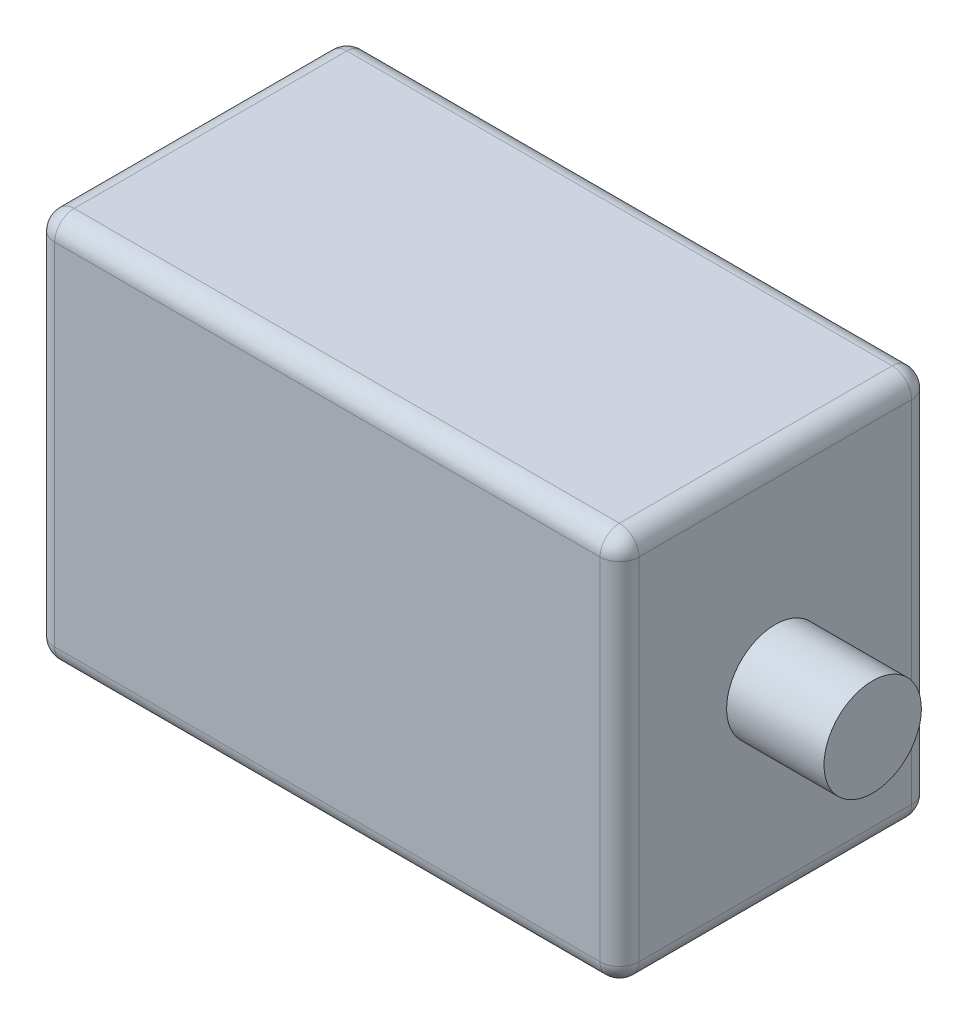
ISO-10303-21;
HEADER;
FILE_DESCRIPTION(('STEP AP214'),'2;1');
FILE_NAME('part.step','',(''),(''),'','','');
FILE_SCHEMA(('AUTOMOTIVE_DESIGN { 1 0 10303 214 1 1 1 1 }'));
ENDSEC;
DATA;
#1=APPLICATION_CONTEXT('core data for automotive mechanical design processes');
#2=APPLICATION_PROTOCOL_DEFINITION('international standard','automotive_design',2000,#1);
#3=PRODUCT_CONTEXT('',#1,'mechanical');
#4=PRODUCT('Part','Part','',(#3));
#5=PRODUCT_RELATED_PRODUCT_CATEGORY('part','',(#4));
#6=PRODUCT_DEFINITION_FORMATION('','',#4);
#7=PRODUCT_DEFINITION_CONTEXT('part definition',#1,'design');
#8=PRODUCT_DEFINITION('design','',#6,#7);
#9=PRODUCT_DEFINITION_SHAPE('','',#8);
#10=(LENGTH_UNIT() NAMED_UNIT(*) SI_UNIT(.MILLI.,.METRE.));
#11=(NAMED_UNIT(*) PLANE_ANGLE_UNIT() SI_UNIT($,.RADIAN.));
#12=(NAMED_UNIT(*) SI_UNIT($,.STERADIAN.) SOLID_ANGLE_UNIT());
#13=UNCERTAINTY_MEASURE_WITH_UNIT(LENGTH_MEASURE(1.E-05),#10,'distance_accuracy_value','');
#14=(GEOMETRIC_REPRESENTATION_CONTEXT(3) GLOBAL_UNCERTAINTY_ASSIGNED_CONTEXT((#13)) GLOBAL_UNIT_ASSIGNED_CONTEXT((#10,
#11,#12)) REPRESENTATION_CONTEXT('',''));
#15=CARTESIAN_POINT('',(0.,0.,0.));
#16=DIRECTION('',(0.,0.,1.));
#17=DIRECTION('',(1.,0.,0.));
#18=AXIS2_PLACEMENT_3D('',#15,#16,#17);
#19=CARTESIAN_POINT('',(15.,10.,16.));
#20=DIRECTION('',(-1.,0.,0.));
#21=DIRECTION('',(0.,-1.,0.));
#22=AXIS2_PLACEMENT_3D('',#19,#20,#21);
#23=PLANE('',#22);
#24=DIRECTION('',(0.,1.,0.));
#25=VECTOR('',#24,1.);
#26=CARTESIAN_POINT('',(15.,-10.,15.));
#27=LINE('',#26,#25);
#28=CARTESIAN_POINT('',(15.,9.,15.));
#29=VERTEX_POINT('',#28);
#30=CARTESIAN_POINT('',(15.,-9.,15.));
#31=VERTEX_POINT('',#30);
#32=EDGE_CURVE('E139',#29,#31,#27,.F.);
#33=ORIENTED_EDGE('',*,*,#32,.T.);
#34=DIRECTION('',(0.,0.,-1.));
#35=VECTOR('',#34,1.);
#36=CARTESIAN_POINT('',(15.,-9.,16.));
#37=LINE('',#36,#35);
#38=CARTESIAN_POINT('',(15.,-9.,1.));
#39=VERTEX_POINT('',#38);
#40=EDGE_CURVE('E134',#31,#39,#37,.T.);
#41=ORIENTED_EDGE('',*,*,#40,.T.);
#42=DIRECTION('',(0.,1.,0.));
#43=VECTOR('',#42,1.);
#44=CARTESIAN_POINT('',(15.,10.,1.));
#45=LINE('',#44,#43);
#46=CARTESIAN_POINT('',(15.,9.,1.));
#47=VERTEX_POINT('',#46);
#48=EDGE_CURVE('E128',#39,#47,#45,.T.);
#49=ORIENTED_EDGE('',*,*,#48,.T.);
#50=DIRECTION('',(0.,0.,-1.));
#51=VECTOR('',#50,1.);
#52=CARTESIAN_POINT('',(15.,9.,16.));
#53=LINE('',#52,#51);
#54=EDGE_CURVE('E131',#47,#29,#53,.F.);
#55=ORIENTED_EDGE('',*,*,#54,.T.);
#56=EDGE_LOOP('',(#33,#41,#49,#55));
#57=FACE_BOUND('',#56,.T.);
#58=CARTESIAN_POINT('',(15.,0.,8.));
#59=DIRECTION('',(1.,0.,0.));
#60=DIRECTION('',(0.,1.,0.));
#61=AXIS2_PLACEMENT_3D('',#58,#59,#60);
#62=CIRCLE('',#61,2.5);
#63=CARTESIAN_POINT('',(15.,2.5,8.));
#64=VERTEX_POINT('',#63);
#65=EDGE_CURVE('E152',#64,#64,#62,.T.);
#66=ORIENTED_EDGE('',*,*,#65,.F.);
#67=EDGE_LOOP('',(#66));
#68=FACE_BOUND('',#67,.T.);
#69=ADVANCED_FACE('F39',(#57,#68),#23,.F.);
#70=CARTESIAN_POINT('',(-15.,10.,16.));
#71=DIRECTION('',(0.,-1.,0.));
#72=DIRECTION('',(0.,0.,-1.));
#73=AXIS2_PLACEMENT_3D('',#70,#71,#72);
#74=PLANE('',#73);
#75=DIRECTION('',(-1.,0.,0.));
#76=VECTOR('',#75,1.);
#77=CARTESIAN_POINT('',(-15.,10.,1.));
#78=LINE('',#77,#76);
#79=CARTESIAN_POINT('',(14.,10.,1.));
#80=VERTEX_POINT('',#79);
#81=CARTESIAN_POINT('',(-14.,10.,1.));
#82=VERTEX_POINT('',#81);
#83=EDGE_CURVE('E285',#80,#82,#78,.T.);
#84=ORIENTED_EDGE('',*,*,#83,.T.);
#85=DIRECTION('',(0.,0.,-1.));
#86=VECTOR('',#85,1.);
#87=CARTESIAN_POINT('',(-14.,10.,16.));
#88=LINE('',#87,#86);
#89=CARTESIAN_POINT('',(-14.,10.,15.));
#90=VERTEX_POINT('',#89);
#91=EDGE_CURVE('E294',#82,#90,#88,.F.);
#92=ORIENTED_EDGE('',*,*,#91,.T.);
#93=DIRECTION('',(-1.,0.,0.));
#94=VECTOR('',#93,1.);
#95=CARTESIAN_POINT('',(15.,10.,15.));
#96=LINE('',#95,#94);
#97=CARTESIAN_POINT('',(14.,10.,15.));
#98=VERTEX_POINT('',#97);
#99=EDGE_CURVE('E291',#90,#98,#96,.F.);
#100=ORIENTED_EDGE('',*,*,#99,.T.);
#101=DIRECTION('',(0.,0.,-1.));
#102=VECTOR('',#101,1.);
#103=CARTESIAN_POINT('',(14.,10.,16.));
#104=LINE('',#103,#102);
#105=EDGE_CURVE('E288',#98,#80,#104,.T.);
#106=ORIENTED_EDGE('',*,*,#105,.T.);
#107=EDGE_LOOP('',(#84,#92,#100,#106));
#108=FACE_BOUND('',#107,.T.);
#109=ADVANCED_FACE('F360',(#108),#74,.F.);
#110=CARTESIAN_POINT('',(-15.,10.,16.));
#111=DIRECTION('',(1.,0.,0.));
#112=DIRECTION('',(0.,0.,-1.));
#113=AXIS2_PLACEMENT_3D('',#110,#111,#112);
#114=PLANE('',#113);
#115=DIRECTION('',(0.,0.,-1.));
#116=VECTOR('',#115,1.);
#117=CARTESIAN_POINT('',(-15.,-9.,16.));
#118=LINE('',#117,#116);
#119=CARTESIAN_POINT('',(-15.,-9.,1.));
#120=VERTEX_POINT('',#119);
#121=CARTESIAN_POINT('',(-15.,-9.,15.));
#122=VERTEX_POINT('',#121);
#123=EDGE_CURVE('E272',#120,#122,#118,.F.);
#124=ORIENTED_EDGE('',*,*,#123,.T.);
#125=DIRECTION('',(0.,-1.,0.));
#126=VECTOR('',#125,1.);
#127=CARTESIAN_POINT('',(-15.,10.,15.));
#128=LINE('',#127,#126);
#129=CARTESIAN_POINT('',(-15.,9.,15.));
#130=VERTEX_POINT('',#129);
#131=EDGE_CURVE('E281',#122,#130,#128,.F.);
#132=ORIENTED_EDGE('',*,*,#131,.T.);
#133=DIRECTION('',(0.,0.,-1.));
#134=VECTOR('',#133,1.);
#135=CARTESIAN_POINT('',(-15.,9.,16.));
#136=LINE('',#135,#134);
#137=CARTESIAN_POINT('',(-15.,9.,1.));
#138=VERTEX_POINT('',#137);
#139=EDGE_CURVE('E278',#130,#138,#136,.T.);
#140=ORIENTED_EDGE('',*,*,#139,.T.);
#141=DIRECTION('',(0.,-1.,0.));
#142=VECTOR('',#141,1.);
#143=CARTESIAN_POINT('',(-15.,10.,1.));
#144=LINE('',#143,#142);
#145=EDGE_CURVE('E275',#138,#120,#144,.T.);
#146=ORIENTED_EDGE('',*,*,#145,.T.);
#147=EDGE_LOOP('',(#124,#132,#140,#146));
#148=FACE_BOUND('',#147,.T.);
#149=ADVANCED_FACE('F364',(#148),#114,.F.);
#150=CARTESIAN_POINT('',(-15.,-10.,16.));
#151=DIRECTION('',(0.,1.,0.));
#152=DIRECTION('',(0.,0.,1.));
#153=AXIS2_PLACEMENT_3D('',#150,#151,#152);
#154=PLANE('',#153);
#155=DIRECTION('',(0.,0.,-1.));
#156=VECTOR('',#155,1.);
#157=CARTESIAN_POINT('',(-14.,-10.,16.));
#158=LINE('',#157,#156);
#159=CARTESIAN_POINT('',(-14.,-10.,15.));
#160=VERTEX_POINT('',#159);
#161=CARTESIAN_POINT('',(-14.,-10.,1.));
#162=VERTEX_POINT('',#161);
#163=EDGE_CURVE('E249',#160,#162,#158,.T.);
#164=ORIENTED_EDGE('',*,*,#163,.T.);
#165=DIRECTION('',(1.,0.,0.));
#166=VECTOR('',#165,1.);
#167=CARTESIAN_POINT('',(-15.,-10.,1.));
#168=LINE('',#167,#166);
#169=CARTESIAN_POINT('',(14.,-10.,1.));
#170=VERTEX_POINT('',#169);
#171=EDGE_CURVE('E256',#162,#170,#168,.T.);
#172=ORIENTED_EDGE('',*,*,#171,.T.);
#173=DIRECTION('',(0.,0.,-1.));
#174=VECTOR('',#173,1.);
#175=CARTESIAN_POINT('',(14.,-10.,16.));
#176=LINE('',#175,#174);
#177=CARTESIAN_POINT('',(14.,-10.,15.));
#178=VERTEX_POINT('',#177);
#179=EDGE_CURVE('E252',#170,#178,#176,.F.);
#180=ORIENTED_EDGE('',*,*,#179,.T.);
#181=DIRECTION('',(1.,0.,0.));
#182=VECTOR('',#181,1.);
#183=CARTESIAN_POINT('',(-15.,-10.,15.));
#184=LINE('',#183,#182);
#185=EDGE_CURVE('E246',#178,#160,#184,.F.);
#186=ORIENTED_EDGE('',*,*,#185,.T.);
#187=EDGE_LOOP('',(#164,#172,#180,#186));
#188=FACE_BOUND('',#187,.T.);
#189=ADVANCED_FACE('F336',(#188),#154,.F.);
#190=CARTESIAN_POINT('',(0.,0.,16.));
#191=DIRECTION('',(0.,0.,1.));
#192=DIRECTION('',(1.,0.,0.));
#193=AXIS2_PLACEMENT_3D('',#190,#191,#192);
#194=PLANE('',#193);
#195=DIRECTION('',(-1.,0.,0.));
#196=VECTOR('',#195,1.);
#197=CARTESIAN_POINT('',(-15.,9.,16.));
#198=LINE('',#197,#196);
#199=CARTESIAN_POINT('',(14.,9.,16.));
#200=VERTEX_POINT('',#199);
#201=CARTESIAN_POINT('',(-14.,9.,16.));
#202=VERTEX_POINT('',#201);
#203=EDGE_CURVE('E262',#200,#202,#198,.T.);
#204=ORIENTED_EDGE('',*,*,#203,.T.);
#205=DIRECTION('',(0.,-1.,0.));
#206=VECTOR('',#205,1.);
#207=CARTESIAN_POINT('',(-14.,-10.,16.));
#208=LINE('',#207,#206);
#209=CARTESIAN_POINT('',(-14.,-9.,16.));
#210=VERTEX_POINT('',#209);
#211=EDGE_CURVE('E268',#202,#210,#208,.T.);
#212=ORIENTED_EDGE('',*,*,#211,.T.);
#213=DIRECTION('',(1.,0.,0.));
#214=VECTOR('',#213,1.);
#215=CARTESIAN_POINT('',(15.,-9.,16.));
#216=LINE('',#215,#214);
#217=CARTESIAN_POINT('',(14.,-9.,16.));
#218=VERTEX_POINT('',#217);
#219=EDGE_CURVE('E265',#210,#218,#216,.T.);
#220=ORIENTED_EDGE('',*,*,#219,.T.);
#221=DIRECTION('',(0.,1.,0.));
#222=VECTOR('',#221,1.);
#223=CARTESIAN_POINT('',(14.,10.,16.));
#224=LINE('',#223,#222);
#225=EDGE_CURVE('E259',#218,#200,#224,.T.);
#226=ORIENTED_EDGE('',*,*,#225,.T.);
#227=EDGE_LOOP('',(#204,#212,#220,#226));
#228=FACE_BOUND('',#227,.T.);
#229=ADVANCED_FACE('F562',(#228),#194,.T.);
#230=CARTESIAN_POINT('',(0.,0.,0.));
#231=DIRECTION('',(0.,0.,1.));
#232=DIRECTION('',(1.,0.,0.));
#233=AXIS2_PLACEMENT_3D('',#230,#231,#232);
#234=PLANE('',#233);
#235=DIRECTION('',(1.,0.,0.));
#236=VECTOR('',#235,1.);
#237=CARTESIAN_POINT('',(0.,-9.,0.));
#238=LINE('',#237,#236);
#239=CARTESIAN_POINT('',(14.,-9.,0.));
#240=VERTEX_POINT('',#239);
#241=CARTESIAN_POINT('',(-14.,-9.,0.));
#242=VERTEX_POINT('',#241);
#243=EDGE_CURVE('E49',#240,#242,#238,.F.);
#244=ORIENTED_EDGE('',*,*,#243,.T.);
#245=DIRECTION('',(0.,-1.,0.));
#246=VECTOR('',#245,1.);
#247=CARTESIAN_POINT('',(-14.,0.,0.));
#248=LINE('',#247,#246);
#249=CARTESIAN_POINT('',(-14.,9.,0.));
#250=VERTEX_POINT('',#249);
#251=EDGE_CURVE('E11',#242,#250,#248,.F.);
#252=ORIENTED_EDGE('',*,*,#251,.T.);
#253=DIRECTION('',(-1.,0.,0.));
#254=VECTOR('',#253,1.);
#255=CARTESIAN_POINT('',(0.,9.,0.));
#256=LINE('',#255,#254);
#257=CARTESIAN_POINT('',(14.,9.,0.));
#258=VERTEX_POINT('',#257);
#259=EDGE_CURVE('E298',#250,#258,#256,.F.);
#260=ORIENTED_EDGE('',*,*,#259,.T.);
#261=DIRECTION('',(0.,1.,0.));
#262=VECTOR('',#261,1.);
#263=CARTESIAN_POINT('',(14.,0.,0.));
#264=LINE('',#263,#262);
#265=EDGE_CURVE('E60',#258,#240,#264,.F.);
#266=ORIENTED_EDGE('',*,*,#265,.T.);
#267=EDGE_LOOP('',(#244,#252,#260,#266));
#268=FACE_BOUND('',#267,.T.);
#269=ADVANCED_FACE('F354',(#268),#234,.F.);
#270=CARTESIAN_POINT('',(20.,0.,8.));
#271=DIRECTION('',(-1.,0.,0.));
#272=DIRECTION('',(0.,-1.,0.));
#273=AXIS2_PLACEMENT_3D('',#270,#271,#272);
#274=CYLINDRICAL_SURFACE('',#273,2.5);
#275=CARTESIAN_POINT('',(20.,0.,8.));
#276=DIRECTION('',(1.,0.,0.));
#277=DIRECTION('',(0.,1.,0.));
#278=AXIS2_PLACEMENT_3D('',#275,#276,#277);
#279=CIRCLE('',#278,2.5);
#280=CARTESIAN_POINT('',(20.,2.5,8.));
#281=VERTEX_POINT('',#280);
#282=EDGE_CURVE('E227',#281,#281,#279,.T.);
#283=ORIENTED_EDGE('',*,*,#282,.F.);
#284=EDGE_LOOP('',(#283));
#285=FACE_BOUND('',#284,.T.);
#286=ORIENTED_EDGE('',*,*,#65,.T.);
#287=EDGE_LOOP('',(#286));
#288=FACE_BOUND('',#287,.T.);
#289=ADVANCED_FACE('F547',(#285,#288),#274,.T.);
#290=CARTESIAN_POINT('',(20.,0.,8.));
#291=DIRECTION('',(1.,0.,0.));
#292=DIRECTION('',(0.,1.,0.));
#293=AXIS2_PLACEMENT_3D('',#290,#291,#292);
#294=PLANE('',#293);
#295=ORIENTED_EDGE('',*,*,#282,.T.);
#296=EDGE_LOOP('',(#295));
#297=FACE_BOUND('',#296,.T.);
#298=ADVANCED_FACE('F539',(#297),#294,.T.);
#299=CARTESIAN_POINT('',(-14.,9.,16.));
#300=DIRECTION('',(0.,0.,-1.));
#301=DIRECTION('',(-1.,0.,0.));
#302=AXIS2_PLACEMENT_3D('',#299,#300,#301);
#303=CYLINDRICAL_SURFACE('',#302,1.);
#304=CARTESIAN_POINT('',(-14.,9.,15.));
#305=DIRECTION('',(0.,0.,1.));
#306=DIRECTION('',(1.,0.,0.));
#307=AXIS2_PLACEMENT_3D('',#304,#305,#306);
#308=CIRCLE('',#307,1.);
#309=EDGE_CURVE('E43',#90,#130,#308,.T.);
#310=ORIENTED_EDGE('',*,*,#309,.F.);
#311=ORIENTED_EDGE('',*,*,#91,.F.);
#312=CARTESIAN_POINT('',(-14.,9.,1.));
#313=DIRECTION('',(0.,0.,-1.));
#314=DIRECTION('',(-1.,0.,0.));
#315=AXIS2_PLACEMENT_3D('',#312,#313,#314);
#316=CIRCLE('',#315,1.);
#317=EDGE_CURVE('E218',#138,#82,#316,.T.);
#318=ORIENTED_EDGE('',*,*,#317,.F.);
#319=ORIENTED_EDGE('',*,*,#139,.F.);
#320=EDGE_LOOP('',(#310,#311,#318,#319));
#321=FACE_BOUND('',#320,.T.);
#322=ADVANCED_FACE('F41',(#321),#303,.T.);
#323=CARTESIAN_POINT('',(-14.,9.,15.));
#324=DIRECTION('',(0.,0.,1.));
#325=DIRECTION('',(1.,0.,0.));
#326=AXIS2_PLACEMENT_3D('',#323,#324,#325);
#327=SPHERICAL_SURFACE('',#326,1.);
#328=CARTESIAN_POINT('',(-14.,9.,15.));
#329=DIRECTION('',(-1.,0.,0.));
#330=DIRECTION('',(0.,0.,1.));
#331=AXIS2_PLACEMENT_3D('',#328,#329,#330);
#332=CIRCLE('',#331,1.);
#333=EDGE_CURVE('E212',#90,#202,#332,.F.);
#334=ORIENTED_EDGE('',*,*,#333,.F.);
#335=ORIENTED_EDGE('',*,*,#309,.T.);
#336=CARTESIAN_POINT('',(-14.,9.,15.));
#337=DIRECTION('',(0.,1.,0.));
#338=DIRECTION('',(0.,0.,1.));
#339=AXIS2_PLACEMENT_3D('',#336,#337,#338);
#340=CIRCLE('',#339,1.);
#341=EDGE_CURVE('E216',#202,#130,#340,.F.);
#342=ORIENTED_EDGE('',*,*,#341,.F.);
#343=EDGE_LOOP('',(#334,#335,#342));
#344=FACE_BOUND('',#343,.T.);
#345=ADVANCED_FACE('F525',(#344),#327,.T.);
#346=CARTESIAN_POINT('',(-14.,9.,1.));
#347=DIRECTION('',(0.,0.,1.));
#348=DIRECTION('',(1.,0.,0.));
#349=AXIS2_PLACEMENT_3D('',#346,#347,#348);
#350=SPHERICAL_SURFACE('',#349,1.);
#351=CARTESIAN_POINT('',(-14.,9.,1.));
#352=DIRECTION('',(0.,1.,0.));
#353=DIRECTION('',(0.,0.,1.));
#354=AXIS2_PLACEMENT_3D('',#351,#352,#353);
#355=CIRCLE('',#354,1.);
#356=EDGE_CURVE('E204',#138,#250,#355,.F.);
#357=ORIENTED_EDGE('',*,*,#356,.F.);
#358=ORIENTED_EDGE('',*,*,#317,.T.);
#359=CARTESIAN_POINT('',(-14.,9.,1.));
#360=DIRECTION('',(-1.,0.,0.));
#361=DIRECTION('',(0.,0.,1.));
#362=AXIS2_PLACEMENT_3D('',#359,#360,#361);
#363=CIRCLE('',#362,1.);
#364=EDGE_CURVE('E208',#250,#82,#363,.F.);
#365=ORIENTED_EDGE('',*,*,#364,.F.);
#366=EDGE_LOOP('',(#357,#358,#365));
#367=FACE_BOUND('',#366,.T.);
#368=ADVANCED_FACE('F517',(#367),#350,.T.);
#369=CARTESIAN_POINT('',(-14.,0.,15.));
#370=DIRECTION('',(0.,1.,0.));
#371=DIRECTION('',(0.,0.,1.));
#372=AXIS2_PLACEMENT_3D('',#369,#370,#371);
#373=CYLINDRICAL_SURFACE('',#372,1.);
#374=ORIENTED_EDGE('',*,*,#341,.T.);
#375=ORIENTED_EDGE('',*,*,#131,.F.);
#376=CARTESIAN_POINT('',(-14.,-9.,15.));
#377=DIRECTION('',(0.,-1.,0.));
#378=DIRECTION('',(0.,0.,-1.));
#379=AXIS2_PLACEMENT_3D('',#376,#377,#378);
#380=CIRCLE('',#379,1.);
#381=EDGE_CURVE('E196',#210,#122,#380,.T.);
#382=ORIENTED_EDGE('',*,*,#381,.F.);
#383=ORIENTED_EDGE('',*,*,#211,.F.);
#384=EDGE_LOOP('',(#374,#375,#382,#383));
#385=FACE_BOUND('',#384,.T.);
#386=ADVANCED_FACE('F369',(#385),#373,.T.);
#387=CARTESIAN_POINT('',(0.,9.,15.));
#388=DIRECTION('',(1.,0.,0.));
#389=DIRECTION('',(0.,0.,-1.));
#390=AXIS2_PLACEMENT_3D('',#387,#388,#389);
#391=CYLINDRICAL_SURFACE('',#390,1.);
#392=ORIENTED_EDGE('',*,*,#333,.T.);
#393=ORIENTED_EDGE('',*,*,#203,.F.);
#394=CARTESIAN_POINT('',(14.,9.,15.));
#395=DIRECTION('',(1.,0.,0.));
#396=DIRECTION('',(0.,0.,-1.));
#397=AXIS2_PLACEMENT_3D('',#394,#395,#396);
#398=CIRCLE('',#397,1.);
#399=EDGE_CURVE('E192',#98,#200,#398,.T.);
#400=ORIENTED_EDGE('',*,*,#399,.F.);
#401=ORIENTED_EDGE('',*,*,#99,.F.);
#402=EDGE_LOOP('',(#392,#393,#400,#401));
#403=FACE_BOUND('',#402,.T.);
#404=ADVANCED_FACE('F501',(#403),#391,.T.);
#405=CARTESIAN_POINT('',(14.,9.,16.));
#406=DIRECTION('',(0.,0.,-1.));
#407=DIRECTION('',(-1.,0.,0.));
#408=AXIS2_PLACEMENT_3D('',#405,#406,#407);
#409=CYLINDRICAL_SURFACE('',#408,1.);
#410=CARTESIAN_POINT('',(14.,9.,1.));
#411=DIRECTION('',(0.,0.,-1.));
#412=DIRECTION('',(-1.,0.,0.));
#413=AXIS2_PLACEMENT_3D('',#410,#411,#412);
#414=CIRCLE('',#413,1.);
#415=EDGE_CURVE('E146',#80,#47,#414,.T.);
#416=ORIENTED_EDGE('',*,*,#415,.F.);
#417=ORIENTED_EDGE('',*,*,#105,.F.);
#418=CARTESIAN_POINT('',(14.,9.,15.));
#419=DIRECTION('',(0.,0.,1.));
#420=DIRECTION('',(1.,0.,0.));
#421=AXIS2_PLACEMENT_3D('',#418,#419,#420);
#422=CIRCLE('',#421,1.);
#423=EDGE_CURVE('E149',#29,#98,#422,.T.);
#424=ORIENTED_EDGE('',*,*,#423,.F.);
#425=ORIENTED_EDGE('',*,*,#54,.F.);
#426=EDGE_LOOP('',(#416,#417,#424,#425));
#427=FACE_BOUND('',#426,.T.);
#428=ADVANCED_FACE('F144',(#427),#409,.T.);
#429=CARTESIAN_POINT('',(-15.,9.,1.));
#430=DIRECTION('',(-1.,0.,0.));
#431=DIRECTION('',(0.,0.,1.));
#432=AXIS2_PLACEMENT_3D('',#429,#430,#431);
#433=CYLINDRICAL_SURFACE('',#432,1.);
#434=ORIENTED_EDGE('',*,*,#364,.T.);
#435=ORIENTED_EDGE('',*,*,#83,.F.);
#436=CARTESIAN_POINT('',(14.,9.,1.));
#437=DIRECTION('',(1.,0.,0.));
#438=DIRECTION('',(0.,1.,0.));
#439=AXIS2_PLACEMENT_3D('',#436,#437,#438);
#440=CIRCLE('',#439,1.);
#441=EDGE_CURVE('E159',#258,#80,#440,.T.);
#442=ORIENTED_EDGE('',*,*,#441,.F.);
#443=ORIENTED_EDGE('',*,*,#259,.F.);
#444=EDGE_LOOP('',(#434,#435,#442,#443));
#445=FACE_BOUND('',#444,.T.);
#446=ADVANCED_FACE('F357',(#445),#433,.T.);
#447=CARTESIAN_POINT('',(-14.,10.,1.));
#448=DIRECTION('',(0.,-1.,0.));
#449=DIRECTION('',(0.,0.,-1.));
#450=AXIS2_PLACEMENT_3D('',#447,#448,#449);
#451=CYLINDRICAL_SURFACE('',#450,1.);
#452=ORIENTED_EDGE('',*,*,#356,.T.);
#453=ORIENTED_EDGE('',*,*,#251,.F.);
#454=CARTESIAN_POINT('',(-14.,-9.,1.));
#455=DIRECTION('',(0.,-1.,0.));
#456=DIRECTION('',(0.,0.,-1.));
#457=AXIS2_PLACEMENT_3D('',#454,#455,#456);
#458=CIRCLE('',#457,1.);
#459=EDGE_CURVE('E184',#120,#242,#458,.T.);
#460=ORIENTED_EDGE('',*,*,#459,.F.);
#461=ORIENTED_EDGE('',*,*,#145,.F.);
#462=EDGE_LOOP('',(#452,#453,#460,#461));
#463=FACE_BOUND('',#462,.T.);
#464=ADVANCED_FACE('F353',(#463),#451,.T.);
#465=CARTESIAN_POINT('',(-14.,-9.,16.));
#466=DIRECTION('',(0.,0.,-1.));
#467=DIRECTION('',(-1.,0.,0.));
#468=AXIS2_PLACEMENT_3D('',#465,#466,#467);
#469=CYLINDRICAL_SURFACE('',#468,1.);
#470=CARTESIAN_POINT('',(-14.,-9.,15.));
#471=DIRECTION('',(0.,0.,1.));
#472=DIRECTION('',(1.,0.,0.));
#473=AXIS2_PLACEMENT_3D('',#470,#471,#472);
#474=CIRCLE('',#473,1.);
#475=EDGE_CURVE('E200',#122,#160,#474,.T.);
#476=ORIENTED_EDGE('',*,*,#475,.F.);
#477=ORIENTED_EDGE('',*,*,#123,.F.);
#478=CARTESIAN_POINT('',(-14.,-9.,1.));
#479=DIRECTION('',(0.,0.,-1.));
#480=DIRECTION('',(-1.,0.,0.));
#481=AXIS2_PLACEMENT_3D('',#478,#479,#480);
#482=CIRCLE('',#481,1.);
#483=EDGE_CURVE('E180',#162,#120,#482,.T.);
#484=ORIENTED_EDGE('',*,*,#483,.F.);
#485=ORIENTED_EDGE('',*,*,#163,.F.);
#486=EDGE_LOOP('',(#476,#477,#484,#485));
#487=FACE_BOUND('',#486,.T.);
#488=ADVANCED_FACE('F372',(#487),#469,.T.);
#489=CARTESIAN_POINT('',(-14.,-9.,15.));
#490=DIRECTION('',(0.,0.,1.));
#491=DIRECTION('',(1.,0.,0.));
#492=AXIS2_PLACEMENT_3D('',#489,#490,#491);
#493=SPHERICAL_SURFACE('',#492,1.);
#494=ORIENTED_EDGE('',*,*,#381,.T.);
#495=ORIENTED_EDGE('',*,*,#475,.T.);
#496=CARTESIAN_POINT('',(-14.,-9.,15.));
#497=DIRECTION('',(-1.,0.,0.));
#498=DIRECTION('',(0.,0.,1.));
#499=AXIS2_PLACEMENT_3D('',#496,#497,#498);
#500=CIRCLE('',#499,1.);
#501=EDGE_CURVE('E170',#210,#160,#500,.F.);
#502=ORIENTED_EDGE('',*,*,#501,.F.);
#503=EDGE_LOOP('',(#494,#495,#502));
#504=FACE_BOUND('',#503,.T.);
#505=ADVANCED_FACE('F374',(#504),#493,.T.);
#506=CARTESIAN_POINT('',(14.,9.,15.));
#507=DIRECTION('',(0.,0.,1.));
#508=DIRECTION('',(1.,0.,0.));
#509=AXIS2_PLACEMENT_3D('',#506,#507,#508);
#510=SPHERICAL_SURFACE('',#509,1.);
#511=ORIENTED_EDGE('',*,*,#423,.T.);
#512=ORIENTED_EDGE('',*,*,#399,.T.);
#513=CARTESIAN_POINT('',(14.,9.,15.));
#514=DIRECTION('',(0.,1.,0.));
#515=DIRECTION('',(0.,0.,1.));
#516=AXIS2_PLACEMENT_3D('',#513,#514,#515);
#517=CIRCLE('',#516,1.);
#518=EDGE_CURVE('E164',#29,#200,#517,.F.);
#519=ORIENTED_EDGE('',*,*,#518,.F.);
#520=EDGE_LOOP('',(#511,#512,#519));
#521=FACE_BOUND('',#520,.T.);
#522=ADVANCED_FACE('F376',(#521),#510,.T.);
#523=CARTESIAN_POINT('',(14.,9.,1.));
#524=DIRECTION('',(0.,0.,1.));
#525=DIRECTION('',(1.,0.,0.));
#526=AXIS2_PLACEMENT_3D('',#523,#524,#525);
#527=SPHERICAL_SURFACE('',#526,1.);
#528=ORIENTED_EDGE('',*,*,#441,.T.);
#529=ORIENTED_EDGE('',*,*,#415,.T.);
#530=CARTESIAN_POINT('',(14.,9.,1.));
#531=DIRECTION('',(0.,1.,0.));
#532=DIRECTION('',(0.,0.,1.));
#533=AXIS2_PLACEMENT_3D('',#530,#531,#532);
#534=CIRCLE('',#533,1.);
#535=EDGE_CURVE('E157',#258,#47,#534,.F.);
#536=ORIENTED_EDGE('',*,*,#535,.F.);
#537=EDGE_LOOP('',(#528,#529,#536));
#538=FACE_BOUND('',#537,.T.);
#539=ADVANCED_FACE('F156',(#538),#527,.T.);
#540=CARTESIAN_POINT('',(-14.,-9.,1.));
#541=DIRECTION('',(0.,0.,1.));
#542=DIRECTION('',(1.,0.,0.));
#543=AXIS2_PLACEMENT_3D('',#540,#541,#542);
#544=SPHERICAL_SURFACE('',#543,1.);
#545=ORIENTED_EDGE('',*,*,#483,.T.);
#546=ORIENTED_EDGE('',*,*,#459,.T.);
#547=CARTESIAN_POINT('',(-14.,-9.,1.));
#548=DIRECTION('',(-1.,0.,0.));
#549=DIRECTION('',(0.,0.,1.));
#550=AXIS2_PLACEMENT_3D('',#547,#548,#549);
#551=CIRCLE('',#550,1.);
#552=EDGE_CURVE('E165',#162,#242,#551,.F.);
#553=ORIENTED_EDGE('',*,*,#552,.F.);
#554=EDGE_LOOP('',(#545,#546,#553));
#555=FACE_BOUND('',#554,.T.);
#556=ADVANCED_FACE('F348',(#555),#544,.T.);
#557=CARTESIAN_POINT('',(0.,-9.,15.));
#558=DIRECTION('',(-1.,0.,0.));
#559=DIRECTION('',(0.,0.,1.));
#560=AXIS2_PLACEMENT_3D('',#557,#558,#559);
#561=CYLINDRICAL_SURFACE('',#560,1.);
#562=ORIENTED_EDGE('',*,*,#501,.T.);
#563=ORIENTED_EDGE('',*,*,#185,.F.);
#564=CARTESIAN_POINT('',(14.,-9.,15.));
#565=DIRECTION('',(1.,0.,0.));
#566=DIRECTION('',(0.,0.,-1.));
#567=AXIS2_PLACEMENT_3D('',#564,#565,#566);
#568=CIRCLE('',#567,1.);
#569=EDGE_CURVE('E173',#218,#178,#568,.T.);
#570=ORIENTED_EDGE('',*,*,#569,.F.);
#571=ORIENTED_EDGE('',*,*,#219,.F.);
#572=EDGE_LOOP('',(#562,#563,#570,#571));
#573=FACE_BOUND('',#572,.T.);
#574=ADVANCED_FACE('F331',(#573),#561,.T.);
#575=CARTESIAN_POINT('',(14.,0.,15.));
#576=DIRECTION('',(0.,-1.,0.));
#577=DIRECTION('',(1.,0.,0.));
#578=AXIS2_PLACEMENT_3D('',#575,#576,#577);
#579=CYLINDRICAL_SURFACE('',#578,1.);
#580=ORIENTED_EDGE('',*,*,#518,.T.);
#581=ORIENTED_EDGE('',*,*,#225,.F.);
#582=CARTESIAN_POINT('',(14.,-9.,15.));
#583=DIRECTION('',(0.,-1.,0.));
#584=DIRECTION('',(0.,0.,-1.));
#585=AXIS2_PLACEMENT_3D('',#582,#583,#584);
#586=CIRCLE('',#585,1.);
#587=EDGE_CURVE('E319',#31,#218,#586,.T.);
#588=ORIENTED_EDGE('',*,*,#587,.F.);
#589=ORIENTED_EDGE('',*,*,#32,.F.);
#590=EDGE_LOOP('',(#580,#581,#588,#589));
#591=FACE_BOUND('',#590,.T.);
#592=ADVANCED_FACE('F403',(#591),#579,.T.);
#593=CARTESIAN_POINT('',(14.,10.,1.));
#594=DIRECTION('',(0.,1.,0.));
#595=DIRECTION('',(-1.,0.,0.));
#596=AXIS2_PLACEMENT_3D('',#593,#594,#595);
#597=CYLINDRICAL_SURFACE('',#596,1.);
#598=ORIENTED_EDGE('',*,*,#535,.T.);
#599=ORIENTED_EDGE('',*,*,#48,.F.);
#600=CARTESIAN_POINT('',(14.,-9.,1.));
#601=DIRECTION('',(0.,-1.,0.));
#602=DIRECTION('',(0.,0.,-1.));
#603=AXIS2_PLACEMENT_3D('',#600,#601,#602);
#604=CIRCLE('',#603,1.);
#605=EDGE_CURVE('E315',#240,#39,#604,.T.);
#606=ORIENTED_EDGE('',*,*,#605,.F.);
#607=ORIENTED_EDGE('',*,*,#265,.F.);
#608=EDGE_LOOP('',(#598,#599,#606,#607));
#609=FACE_BOUND('',#608,.T.);
#610=ADVANCED_FACE('F162',(#609),#597,.T.);
#611=CARTESIAN_POINT('',(-15.,-9.,1.));
#612=DIRECTION('',(1.,0.,0.));
#613=DIRECTION('',(0.,0.,-1.));
#614=AXIS2_PLACEMENT_3D('',#611,#612,#613);
#615=CYLINDRICAL_SURFACE('',#614,1.);
#616=ORIENTED_EDGE('',*,*,#552,.T.);
#617=ORIENTED_EDGE('',*,*,#243,.F.);
#618=CARTESIAN_POINT('',(14.,-9.,1.));
#619=DIRECTION('',(1.,0.,0.));
#620=DIRECTION('',(0.,0.,-1.));
#621=AXIS2_PLACEMENT_3D('',#618,#619,#620);
#622=CIRCLE('',#621,1.);
#623=EDGE_CURVE('E311',#170,#240,#622,.T.);
#624=ORIENTED_EDGE('',*,*,#623,.F.);
#625=ORIENTED_EDGE('',*,*,#171,.F.);
#626=EDGE_LOOP('',(#616,#617,#624,#625));
#627=FACE_BOUND('',#626,.T.);
#628=ADVANCED_FACE('F345',(#627),#615,.T.);
#629=CARTESIAN_POINT('',(14.,-9.,15.));
#630=DIRECTION('',(0.,0.,1.));
#631=DIRECTION('',(1.,0.,0.));
#632=AXIS2_PLACEMENT_3D('',#629,#630,#631);
#633=SPHERICAL_SURFACE('',#632,1.);
#634=ORIENTED_EDGE('',*,*,#587,.T.);
#635=ORIENTED_EDGE('',*,*,#569,.T.);
#636=CARTESIAN_POINT('',(14.,-9.,15.));
#637=DIRECTION('',(0.,0.,1.));
#638=DIRECTION('',(1.,0.,0.));
#639=AXIS2_PLACEMENT_3D('',#636,#637,#638);
#640=CIRCLE('',#639,1.);
#641=EDGE_CURVE('E308',#31,#178,#640,.F.);
#642=ORIENTED_EDGE('',*,*,#641,.F.);
#643=EDGE_LOOP('',(#634,#635,#642));
#644=FACE_BOUND('',#643,.T.);
#645=ADVANCED_FACE('F328',(#644),#633,.T.);
#646=CARTESIAN_POINT('',(14.,-9.,1.));
#647=DIRECTION('',(0.,0.,1.));
#648=DIRECTION('',(1.,0.,0.));
#649=AXIS2_PLACEMENT_3D('',#646,#647,#648);
#650=SPHERICAL_SURFACE('',#649,1.);
#651=ORIENTED_EDGE('',*,*,#623,.T.);
#652=ORIENTED_EDGE('',*,*,#605,.T.);
#653=CARTESIAN_POINT('',(14.,-9.,1.));
#654=DIRECTION('',(0.,0.,-1.));
#655=DIRECTION('',(-1.,0.,0.));
#656=AXIS2_PLACEMENT_3D('',#653,#654,#655);
#657=CIRCLE('',#656,1.);
#658=EDGE_CURVE('E305',#170,#39,#657,.F.);
#659=ORIENTED_EDGE('',*,*,#658,.F.);
#660=EDGE_LOOP('',(#651,#652,#659));
#661=FACE_BOUND('',#660,.T.);
#662=ADVANCED_FACE('F343',(#661),#650,.T.);
#663=CARTESIAN_POINT('',(14.,-9.,16.));
#664=DIRECTION('',(0.,0.,-1.));
#665=DIRECTION('',(-1.,0.,0.));
#666=AXIS2_PLACEMENT_3D('',#663,#664,#665);
#667=CYLINDRICAL_SURFACE('',#666,1.);
#668=ORIENTED_EDGE('',*,*,#641,.T.);
#669=ORIENTED_EDGE('',*,*,#179,.F.);
#670=ORIENTED_EDGE('',*,*,#658,.T.);
#671=ORIENTED_EDGE('',*,*,#40,.F.);
#672=EDGE_LOOP('',(#668,#669,#670,#671));
#673=FACE_BOUND('',#672,.T.);
#674=ADVANCED_FACE('F341',(#673),#667,.T.);
#675=CLOSED_SHELL('',(#69,#109,#149,#189,#229,#269,#289,#298,#322,#345,#368,#386,#404,#428,#446,
#464,#488,#505,#522,#539,#556,#574,#592,#610,#628,#645,#662,#674));
#676=MANIFOLD_SOLID_BREP('B2',#675);
#677=ADVANCED_BREP_SHAPE_REPRESENTATION('',(#18,#676),#14);
#678=SHAPE_DEFINITION_REPRESENTATION(#9,#677);
ENDSEC;
END-ISO-10303-21;
